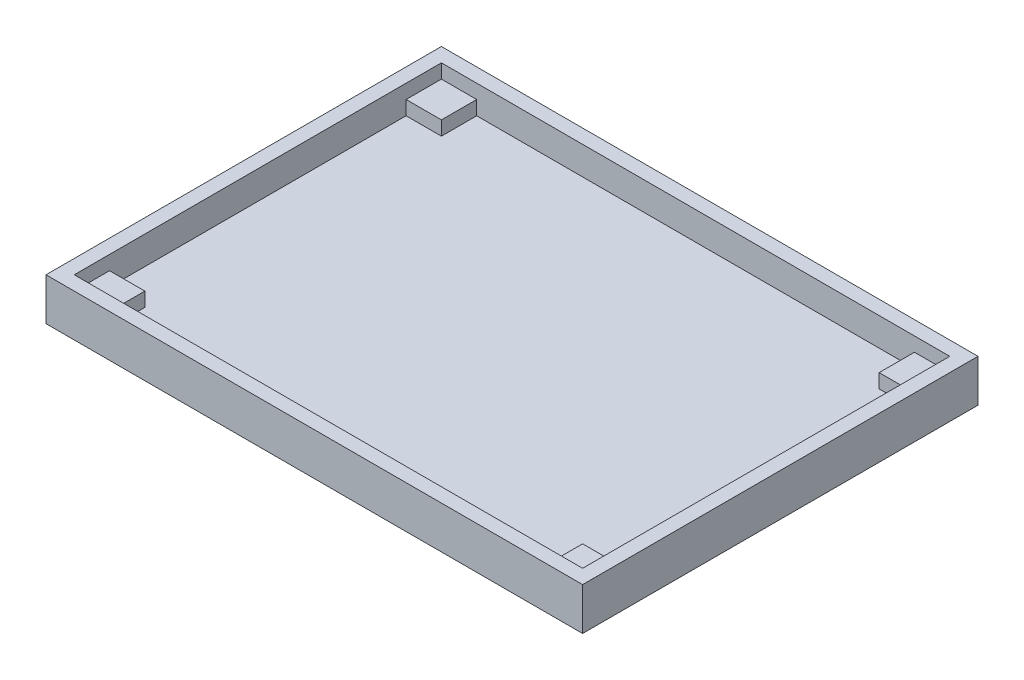
ISO-10303-21;
HEADER;
FILE_DESCRIPTION(('STEP AP214'),'2;1');
FILE_NAME('part.step','',(''),(''),'','','');
FILE_SCHEMA(('AUTOMOTIVE_DESIGN { 1 0 10303 214 1 1 1 1 }'));
ENDSEC;
DATA;
#1=APPLICATION_CONTEXT('core data for automotive mechanical design processes');
#2=APPLICATION_PROTOCOL_DEFINITION('international standard','automotive_design',2000,#1);
#3=PRODUCT_CONTEXT('',#1,'mechanical');
#4=PRODUCT('Part','Part','',(#3));
#5=PRODUCT_RELATED_PRODUCT_CATEGORY('part','',(#4));
#6=PRODUCT_DEFINITION_FORMATION('','',#4);
#7=PRODUCT_DEFINITION_CONTEXT('part definition',#1,'design');
#8=PRODUCT_DEFINITION('design','',#6,#7);
#9=PRODUCT_DEFINITION_SHAPE('','',#8);
#10=(LENGTH_UNIT() NAMED_UNIT(*) SI_UNIT(.MILLI.,.METRE.));
#11=(NAMED_UNIT(*) PLANE_ANGLE_UNIT() SI_UNIT($,.RADIAN.));
#12=(NAMED_UNIT(*) SI_UNIT($,.STERADIAN.) SOLID_ANGLE_UNIT());
#13=UNCERTAINTY_MEASURE_WITH_UNIT(LENGTH_MEASURE(1.E-05),#10,'distance_accuracy_value','');
#14=(GEOMETRIC_REPRESENTATION_CONTEXT(3) GLOBAL_UNCERTAINTY_ASSIGNED_CONTEXT((#13)) GLOBAL_UNIT_ASSIGNED_CONTEXT((#10,
#11,#12)) REPRESENTATION_CONTEXT('',''));
#15=CARTESIAN_POINT('',(0.,0.,0.));
#16=DIRECTION('',(0.,0.,1.));
#17=DIRECTION('',(1.,0.,0.));
#18=AXIS2_PLACEMENT_3D('',#15,#16,#17);
#19=CARTESIAN_POINT('',(0.,2.,-53.));
#20=DIRECTION('',(0.,0.,-1.));
#21=DIRECTION('',(-1.,0.,0.));
#22=AXIS2_PLACEMENT_3D('',#19,#20,#21);
#23=PLANE('',#22);
#24=DIRECTION('',(1.,0.,0.));
#25=VECTOR('',#24,1.);
#26=CARTESIAN_POINT('',(0.,0.,-53.));
#27=LINE('',#26,#25);
#28=CARTESIAN_POINT('',(-3.,0.,-53.));
#29=VERTEX_POINT('',#28);
#30=CARTESIAN_POINT('',(73.,0.,-53.));
#31=VERTEX_POINT('',#30);
#32=EDGE_CURVE('E187',#29,#31,#27,.T.);
#33=ORIENTED_EDGE('',*,*,#32,.F.);
#34=DIRECTION('',(0.,-1.,0.));
#35=VECTOR('',#34,1.);
#36=CARTESIAN_POINT('',(-3.,2.,-53.));
#37=LINE('',#36,#35);
#38=CARTESIAN_POINT('',(-3.,6.,-53.));
#39=VERTEX_POINT('',#38);
#40=EDGE_CURVE('E11',#39,#29,#37,.T.);
#41=ORIENTED_EDGE('',*,*,#40,.F.);
#42=DIRECTION('',(1.,0.,0.));
#43=VECTOR('',#42,1.);
#44=CARTESIAN_POINT('',(0.,6.,-53.));
#45=LINE('',#44,#43);
#46=CARTESIAN_POINT('',(73.,6.,-53.));
#47=VERTEX_POINT('',#46);
#48=EDGE_CURVE('E185',#39,#47,#45,.T.);
#49=ORIENTED_EDGE('',*,*,#48,.T.);
#50=DIRECTION('',(0.,-1.,0.));
#51=VECTOR('',#50,1.);
#52=CARTESIAN_POINT('',(73.,2.,-53.));
#53=LINE('',#52,#51);
#54=EDGE_CURVE('E70',#47,#31,#53,.T.);
#55=ORIENTED_EDGE('',*,*,#54,.T.);
#56=EDGE_LOOP('',(#33,#41,#49,#55));
#57=FACE_BOUND('',#56,.T.);
#58=ADVANCED_FACE('F47',(#57),#23,.T.);
#59=CARTESIAN_POINT('',(-3.,2.,0.));
#60=DIRECTION('',(1.,0.,0.));
#61=DIRECTION('',(0.,0.,-1.));
#62=AXIS2_PLACEMENT_3D('',#59,#60,#61);
#63=PLANE('',#62);
#64=DIRECTION('',(0.,0.,1.));
#65=VECTOR('',#64,1.);
#66=CARTESIAN_POINT('',(-3.,0.,0.));
#67=LINE('',#66,#65);
#68=CARTESIAN_POINT('',(-3.,0.,2.99999999999999));
#69=VERTEX_POINT('',#68);
#70=EDGE_CURVE('E385',#29,#69,#67,.T.);
#71=ORIENTED_EDGE('',*,*,#70,.T.);
#72=DIRECTION('',(0.,-1.,0.));
#73=VECTOR('',#72,1.);
#74=CARTESIAN_POINT('',(-3.,2.,2.99999999999999));
#75=LINE('',#74,#73);
#76=CARTESIAN_POINT('',(-3.,6.,2.99999999999999));
#77=VERTEX_POINT('',#76);
#78=EDGE_CURVE('E55',#77,#69,#75,.T.);
#79=ORIENTED_EDGE('',*,*,#78,.F.);
#80=DIRECTION('',(0.,0.,1.));
#81=VECTOR('',#80,1.);
#82=CARTESIAN_POINT('',(-3.,6.,0.));
#83=LINE('',#82,#81);
#84=EDGE_CURVE('E191',#39,#77,#83,.T.);
#85=ORIENTED_EDGE('',*,*,#84,.F.);
#86=ORIENTED_EDGE('',*,*,#40,.T.);
#87=EDGE_LOOP('',(#71,#79,#85,#86));
#88=FACE_BOUND('',#87,.T.);
#89=ADVANCED_FACE('F192',(#88),#63,.F.);
#90=CARTESIAN_POINT('',(0.,2.,2.99999999999999));
#91=DIRECTION('',(0.,0.,-1.));
#92=DIRECTION('',(-1.,0.,0.));
#93=AXIS2_PLACEMENT_3D('',#90,#91,#92);
#94=PLANE('',#93);
#95=DIRECTION('',(1.,0.,0.));
#96=VECTOR('',#95,1.);
#97=CARTESIAN_POINT('',(0.,0.,2.99999999999999));
#98=LINE('',#97,#96);
#99=CARTESIAN_POINT('',(73.,0.,2.99999999999999));
#100=VERTEX_POINT('',#99);
#101=EDGE_CURVE('E388',#69,#100,#98,.T.);
#102=ORIENTED_EDGE('',*,*,#101,.T.);
#103=DIRECTION('',(0.,-1.,0.));
#104=VECTOR('',#103,1.);
#105=CARTESIAN_POINT('',(73.,2.,2.99999999999999));
#106=LINE('',#105,#104);
#107=CARTESIAN_POINT('',(73.,6.,2.99999999999999));
#108=VERTEX_POINT('',#107);
#109=EDGE_CURVE('E398',#108,#100,#106,.T.);
#110=ORIENTED_EDGE('',*,*,#109,.F.);
#111=DIRECTION('',(1.,0.,0.));
#112=VECTOR('',#111,1.);
#113=CARTESIAN_POINT('',(0.,6.,2.99999999999999));
#114=LINE('',#113,#112);
#115=EDGE_CURVE('E198',#77,#108,#114,.T.);
#116=ORIENTED_EDGE('',*,*,#115,.F.);
#117=ORIENTED_EDGE('',*,*,#78,.T.);
#118=EDGE_LOOP('',(#102,#110,#116,#117));
#119=FACE_BOUND('',#118,.T.);
#120=ADVANCED_FACE('F403',(#119),#94,.F.);
#121=CARTESIAN_POINT('',(73.,2.,0.));
#122=DIRECTION('',(1.,0.,0.));
#123=DIRECTION('',(0.,0.,-1.));
#124=AXIS2_PLACEMENT_3D('',#121,#122,#123);
#125=PLANE('',#124);
#126=DIRECTION('',(0.,0.,1.));
#127=VECTOR('',#126,1.);
#128=CARTESIAN_POINT('',(73.,0.,0.));
#129=LINE('',#128,#127);
#130=EDGE_CURVE('E392',#31,#100,#129,.T.);
#131=ORIENTED_EDGE('',*,*,#130,.F.);
#132=ORIENTED_EDGE('',*,*,#54,.F.);
#133=DIRECTION('',(0.,0.,1.));
#134=VECTOR('',#133,1.);
#135=CARTESIAN_POINT('',(73.,6.,0.));
#136=LINE('',#135,#134);
#137=EDGE_CURVE('E203',#47,#108,#136,.T.);
#138=ORIENTED_EDGE('',*,*,#137,.T.);
#139=ORIENTED_EDGE('',*,*,#109,.T.);
#140=EDGE_LOOP('',(#131,#132,#138,#139));
#141=FACE_BOUND('',#140,.T.);
#142=ADVANCED_FACE('F408',(#141),#125,.T.);
#143=CARTESIAN_POINT('',(0.,0.,0.));
#144=DIRECTION('',(0.,1.,0.));
#145=DIRECTION('',(0.,0.,1.));
#146=AXIS2_PLACEMENT_3D('',#143,#144,#145);
#147=PLANE('',#146);
#148=ORIENTED_EDGE('',*,*,#32,.T.);
#149=ORIENTED_EDGE('',*,*,#130,.T.);
#150=ORIENTED_EDGE('',*,*,#101,.F.);
#151=ORIENTED_EDGE('',*,*,#70,.F.);
#152=EDGE_LOOP('',(#148,#149,#150,#151));
#153=FACE_BOUND('',#152,.T.);
#154=ADVANCED_FACE('F405',(#153),#147,.F.);
#155=CARTESIAN_POINT('',(71.,6.,0.));
#156=DIRECTION('',(-1.,0.,0.));
#157=DIRECTION('',(0.,0.,1.));
#158=AXIS2_PLACEMENT_3D('',#155,#156,#157);
#159=PLANE('',#158);
#160=DIRECTION('',(0.,-1.,0.));
#161=VECTOR('',#160,1.);
#162=CARTESIAN_POINT('',(71.,4.,-46.));
#163=LINE('',#162,#161);
#164=CARTESIAN_POINT('',(71.,4.,-46.));
#165=VERTEX_POINT('',#164);
#166=CARTESIAN_POINT('',(71.,2.,-46.));
#167=VERTEX_POINT('',#166);
#168=EDGE_CURVE('E296',#165,#167,#163,.T.);
#169=ORIENTED_EDGE('',*,*,#168,.T.);
#170=DIRECTION('',(0.,0.,1.));
#171=VECTOR('',#170,1.);
#172=CARTESIAN_POINT('',(71.,2.,0.));
#173=LINE('',#172,#171);
#174=CARTESIAN_POINT('',(71.,2.,-4.));
#175=VERTEX_POINT('',#174);
#176=EDGE_CURVE('E244',#167,#175,#173,.T.);
#177=ORIENTED_EDGE('',*,*,#176,.T.);
#178=DIRECTION('',(0.,-1.,0.));
#179=VECTOR('',#178,1.);
#180=CARTESIAN_POINT('',(71.,4.,-4.));
#181=LINE('',#180,#179);
#182=CARTESIAN_POINT('',(71.,4.,-4.));
#183=VERTEX_POINT('',#182);
#184=EDGE_CURVE('E324',#183,#175,#181,.T.);
#185=ORIENTED_EDGE('',*,*,#184,.F.);
#186=DIRECTION('',(0.,0.,-1.));
#187=VECTOR('',#186,1.);
#188=CARTESIAN_POINT('',(71.,4.,0.));
#189=LINE('',#188,#187);
#190=CARTESIAN_POINT('',(71.,4.,1.));
#191=VERTEX_POINT('',#190);
#192=EDGE_CURVE('E313',#191,#183,#189,.T.);
#193=ORIENTED_EDGE('',*,*,#192,.F.);
#194=DIRECTION('',(0.,-1.,0.));
#195=VECTOR('',#194,1.);
#196=CARTESIAN_POINT('',(71.,6.,1.));
#197=LINE('',#196,#195);
#198=CARTESIAN_POINT('',(71.,6.,1.));
#199=VERTEX_POINT('',#198);
#200=EDGE_CURVE('E230',#199,#191,#197,.T.);
#201=ORIENTED_EDGE('',*,*,#200,.F.);
#202=DIRECTION('',(0.,0.,-1.));
#203=VECTOR('',#202,1.);
#204=CARTESIAN_POINT('',(71.,6.,0.));
#205=LINE('',#204,#203);
#206=CARTESIAN_POINT('',(71.,6.,-51.));
#207=VERTEX_POINT('',#206);
#208=EDGE_CURVE('E218',#199,#207,#205,.T.);
#209=ORIENTED_EDGE('',*,*,#208,.T.);
#210=DIRECTION('',(0.,-1.,0.));
#211=VECTOR('',#210,1.);
#212=CARTESIAN_POINT('',(71.,6.,-51.));
#213=LINE('',#212,#211);
#214=CARTESIAN_POINT('',(71.,4.,-51.));
#215=VERTEX_POINT('',#214);
#216=EDGE_CURVE('E233',#207,#215,#213,.T.);
#217=ORIENTED_EDGE('',*,*,#216,.T.);
#218=DIRECTION('',(0.,0.,-1.));
#219=VECTOR('',#218,1.);
#220=CARTESIAN_POINT('',(71.,4.,0.));
#221=LINE('',#220,#219);
#222=EDGE_CURVE('E292',#165,#215,#221,.T.);
#223=ORIENTED_EDGE('',*,*,#222,.F.);
#224=EDGE_LOOP('',(#169,#177,#185,#193,#201,#209,#217,#223));
#225=FACE_BOUND('',#224,.T.);
#226=ADVANCED_FACE('F415',(#225),#159,.T.);
#227=CARTESIAN_POINT('',(-1.,6.,0.));
#228=DIRECTION('',(-1.,0.,0.));
#229=DIRECTION('',(0.,0.,1.));
#230=AXIS2_PLACEMENT_3D('',#227,#228,#229);
#231=PLANE('',#230);
#232=DIRECTION('',(0.,0.,-1.));
#233=VECTOR('',#232,1.);
#234=CARTESIAN_POINT('',(-1.,4.,0.));
#235=LINE('',#234,#233);
#236=CARTESIAN_POINT('',(-1.,4.,1.));
#237=VERTEX_POINT('',#236);
#238=CARTESIAN_POINT('',(-1.,4.,-4.));
#239=VERTEX_POINT('',#238);
#240=EDGE_CURVE('E340',#237,#239,#235,.T.);
#241=ORIENTED_EDGE('',*,*,#240,.T.);
#242=DIRECTION('',(0.,-1.,0.));
#243=VECTOR('',#242,1.);
#244=CARTESIAN_POINT('',(-1.,4.,-4.));
#245=LINE('',#244,#243);
#246=CARTESIAN_POINT('',(-1.,2.,-4.));
#247=VERTEX_POINT('',#246);
#248=EDGE_CURVE('E343',#239,#247,#245,.T.);
#249=ORIENTED_EDGE('',*,*,#248,.T.);
#250=DIRECTION('',(0.,0.,1.));
#251=VECTOR('',#250,1.);
#252=CARTESIAN_POINT('',(-1.,2.,0.));
#253=LINE('',#252,#251);
#254=CARTESIAN_POINT('',(-1.,2.,-46.));
#255=VERTEX_POINT('',#254);
#256=EDGE_CURVE('E251',#255,#247,#253,.T.);
#257=ORIENTED_EDGE('',*,*,#256,.F.);
#258=DIRECTION('',(0.,-1.,0.));
#259=VECTOR('',#258,1.);
#260=CARTESIAN_POINT('',(-1.,4.,-46.));
#261=LINE('',#260,#259);
#262=CARTESIAN_POINT('',(-1.,4.,-46.));
#263=VERTEX_POINT('',#262);
#264=EDGE_CURVE('E273',#263,#255,#261,.T.);
#265=ORIENTED_EDGE('',*,*,#264,.F.);
#266=DIRECTION('',(0.,0.,-1.));
#267=VECTOR('',#266,1.);
#268=CARTESIAN_POINT('',(-1.,4.,0.));
#269=LINE('',#268,#267);
#270=CARTESIAN_POINT('',(-1.,4.,-51.));
#271=VERTEX_POINT('',#270);
#272=EDGE_CURVE('E263',#263,#271,#269,.T.);
#273=ORIENTED_EDGE('',*,*,#272,.T.);
#274=DIRECTION('',(0.,-1.,0.));
#275=VECTOR('',#274,1.);
#276=CARTESIAN_POINT('',(-1.,6.,-51.));
#277=LINE('',#276,#275);
#278=CARTESIAN_POINT('',(-1.,6.,-51.));
#279=VERTEX_POINT('',#278);
#280=EDGE_CURVE('E237',#279,#271,#277,.T.);
#281=ORIENTED_EDGE('',*,*,#280,.F.);
#282=DIRECTION('',(0.,0.,-1.));
#283=VECTOR('',#282,1.);
#284=CARTESIAN_POINT('',(-1.,6.,0.));
#285=LINE('',#284,#283);
#286=CARTESIAN_POINT('',(-1.,6.,1.));
#287=VERTEX_POINT('',#286);
#288=EDGE_CURVE('E211',#287,#279,#285,.T.);
#289=ORIENTED_EDGE('',*,*,#288,.F.);
#290=DIRECTION('',(0.,-1.,0.));
#291=VECTOR('',#290,1.);
#292=CARTESIAN_POINT('',(-1.,6.,1.));
#293=LINE('',#292,#291);
#294=EDGE_CURVE('E226',#287,#237,#293,.T.);
#295=ORIENTED_EDGE('',*,*,#294,.T.);
#296=EDGE_LOOP('',(#241,#249,#257,#265,#273,#281,#289,#295));
#297=FACE_BOUND('',#296,.T.);
#298=ADVANCED_FACE('F449',(#297),#231,.F.);
#299=CARTESIAN_POINT('',(0.,6.,-51.));
#300=DIRECTION('',(0.,0.,-1.));
#301=DIRECTION('',(-1.,0.,0.));
#302=AXIS2_PLACEMENT_3D('',#299,#300,#301);
#303=PLANE('',#302);
#304=DIRECTION('',(1.,0.,0.));
#305=VECTOR('',#304,1.);
#306=CARTESIAN_POINT('',(0.,4.,-51.));
#307=LINE('',#306,#305);
#308=CARTESIAN_POINT('',(4.,4.,-51.));
#309=VERTEX_POINT('',#308);
#310=EDGE_CURVE('E259',#271,#309,#307,.T.);
#311=ORIENTED_EDGE('',*,*,#310,.T.);
#312=DIRECTION('',(0.,-1.,0.));
#313=VECTOR('',#312,1.);
#314=CARTESIAN_POINT('',(4.,4.,-51.));
#315=LINE('',#314,#313);
#316=CARTESIAN_POINT('',(4.,2.,-51.));
#317=VERTEX_POINT('',#316);
#318=EDGE_CURVE('E277',#309,#317,#315,.T.);
#319=ORIENTED_EDGE('',*,*,#318,.T.);
#320=DIRECTION('',(-1.,0.,0.));
#321=VECTOR('',#320,1.);
#322=CARTESIAN_POINT('',(0.,2.,-51.));
#323=LINE('',#322,#321);
#324=CARTESIAN_POINT('',(66.,2.,-51.));
#325=VERTEX_POINT('',#324);
#326=EDGE_CURVE('E247',#325,#317,#323,.T.);
#327=ORIENTED_EDGE('',*,*,#326,.F.);
#328=DIRECTION('',(0.,-1.,0.));
#329=VECTOR('',#328,1.);
#330=CARTESIAN_POINT('',(66.,4.,-51.));
#331=LINE('',#330,#329);
#332=CARTESIAN_POINT('',(66.,4.,-51.));
#333=VERTEX_POINT('',#332);
#334=EDGE_CURVE('E260',#333,#325,#331,.T.);
#335=ORIENTED_EDGE('',*,*,#334,.F.);
#336=DIRECTION('',(1.,0.,0.));
#337=VECTOR('',#336,1.);
#338=CARTESIAN_POINT('',(0.,4.,-51.));
#339=LINE('',#338,#337);
#340=EDGE_CURVE('E281',#333,#215,#339,.T.);
#341=ORIENTED_EDGE('',*,*,#340,.T.);
#342=ORIENTED_EDGE('',*,*,#216,.F.);
#343=DIRECTION('',(1.,0.,0.));
#344=VECTOR('',#343,1.);
#345=CARTESIAN_POINT('',(0.,6.,-51.));
#346=LINE('',#345,#344);
#347=EDGE_CURVE('E215',#279,#207,#346,.T.);
#348=ORIENTED_EDGE('',*,*,#347,.F.);
#349=ORIENTED_EDGE('',*,*,#280,.T.);
#350=EDGE_LOOP('',(#311,#319,#327,#335,#341,#342,#348,#349));
#351=FACE_BOUND('',#350,.T.);
#352=ADVANCED_FACE('F466',(#351),#303,.F.);
#353=CARTESIAN_POINT('',(0.,6.,1.));
#354=DIRECTION('',(0.,0.,-1.));
#355=DIRECTION('',(-1.,0.,0.));
#356=AXIS2_PLACEMENT_3D('',#353,#354,#355);
#357=PLANE('',#356);
#358=DIRECTION('',(0.,-1.,0.));
#359=VECTOR('',#358,1.);
#360=CARTESIAN_POINT('',(4.,4.,1.));
#361=LINE('',#360,#359);
#362=CARTESIAN_POINT('',(4.,4.,1.));
#363=VERTEX_POINT('',#362);
#364=CARTESIAN_POINT('',(4.,2.,1.));
#365=VERTEX_POINT('',#364);
#366=EDGE_CURVE('E350',#363,#365,#361,.T.);
#367=ORIENTED_EDGE('',*,*,#366,.F.);
#368=DIRECTION('',(1.,0.,0.));
#369=VECTOR('',#368,1.);
#370=CARTESIAN_POINT('',(0.,4.,1.));
#371=LINE('',#370,#369);
#372=EDGE_CURVE('E280',#237,#363,#371,.T.);
#373=ORIENTED_EDGE('',*,*,#372,.F.);
#374=ORIENTED_EDGE('',*,*,#294,.F.);
#375=DIRECTION('',(1.,0.,0.));
#376=VECTOR('',#375,1.);
#377=CARTESIAN_POINT('',(0.,6.,1.));
#378=LINE('',#377,#376);
#379=EDGE_CURVE('E222',#287,#199,#378,.T.);
#380=ORIENTED_EDGE('',*,*,#379,.T.);
#381=ORIENTED_EDGE('',*,*,#200,.T.);
#382=DIRECTION('',(1.,0.,0.));
#383=VECTOR('',#382,1.);
#384=CARTESIAN_POINT('',(0.,4.,1.));
#385=LINE('',#384,#383);
#386=CARTESIAN_POINT('',(66.,4.,1.));
#387=VERTEX_POINT('',#386);
#388=EDGE_CURVE('E309',#387,#191,#385,.T.);
#389=ORIENTED_EDGE('',*,*,#388,.F.);
#390=DIRECTION('',(0.,-1.,0.));
#391=VECTOR('',#390,1.);
#392=CARTESIAN_POINT('',(66.,4.,1.));
#393=LINE('',#392,#391);
#394=CARTESIAN_POINT('',(66.,2.,1.));
#395=VERTEX_POINT('',#394);
#396=EDGE_CURVE('E285',#387,#395,#393,.T.);
#397=ORIENTED_EDGE('',*,*,#396,.T.);
#398=DIRECTION('',(-1.,0.,0.));
#399=VECTOR('',#398,1.);
#400=CARTESIAN_POINT('',(0.,2.,1.));
#401=LINE('',#400,#399);
#402=EDGE_CURVE('E241',#395,#365,#401,.T.);
#403=ORIENTED_EDGE('',*,*,#402,.T.);
#404=EDGE_LOOP('',(#367,#373,#374,#380,#381,#389,#397,#403));
#405=FACE_BOUND('',#404,.T.);
#406=ADVANCED_FACE('F482',(#405),#357,.T.);
#407=CARTESIAN_POINT('',(0.,6.,0.));
#408=DIRECTION('',(0.,1.,0.));
#409=DIRECTION('',(0.,0.,1.));
#410=AXIS2_PLACEMENT_3D('',#407,#408,#409);
#411=PLANE('',#410);
#412=ORIENTED_EDGE('',*,*,#48,.F.);
#413=ORIENTED_EDGE('',*,*,#84,.T.);
#414=ORIENTED_EDGE('',*,*,#115,.T.);
#415=ORIENTED_EDGE('',*,*,#137,.F.);
#416=EDGE_LOOP('',(#412,#413,#414,#415));
#417=FACE_BOUND('',#416,.T.);
#418=ORIENTED_EDGE('',*,*,#288,.T.);
#419=ORIENTED_EDGE('',*,*,#347,.T.);
#420=ORIENTED_EDGE('',*,*,#208,.F.);
#421=ORIENTED_EDGE('',*,*,#379,.F.);
#422=EDGE_LOOP('',(#418,#419,#420,#421));
#423=FACE_BOUND('',#422,.T.);
#424=ADVANCED_FACE('F200',(#417,#423),#411,.T.);
#425=CARTESIAN_POINT('',(0.,4.,0.));
#426=DIRECTION('',(0.,1.,0.));
#427=DIRECTION('',(0.,0.,1.));
#428=AXIS2_PLACEMENT_3D('',#425,#426,#427);
#429=PLANE('',#428);
#430=ORIENTED_EDGE('',*,*,#340,.F.);
#431=DIRECTION('',(0.,0.,1.));
#432=VECTOR('',#431,1.);
#433=CARTESIAN_POINT('',(66.,4.,0.));
#434=LINE('',#433,#432);
#435=CARTESIAN_POINT('',(66.,4.,-46.));
#436=VERTEX_POINT('',#435);
#437=EDGE_CURVE('E284',#333,#436,#434,.T.);
#438=ORIENTED_EDGE('',*,*,#437,.T.);
#439=DIRECTION('',(-1.,0.,0.));
#440=VECTOR('',#439,1.);
#441=CARTESIAN_POINT('',(0.,4.,-46.));
#442=LINE('',#441,#440);
#443=EDGE_CURVE('E288',#165,#436,#442,.T.);
#444=ORIENTED_EDGE('',*,*,#443,.F.);
#445=ORIENTED_EDGE('',*,*,#222,.T.);
#446=EDGE_LOOP('',(#430,#438,#444,#445));
#447=FACE_BOUND('',#446,.T.);
#448=ADVANCED_FACE('F513',(#447),#429,.T.);
#449=CARTESIAN_POINT('',(0.,4.,-46.));
#450=DIRECTION('',(0.,0.,1.));
#451=DIRECTION('',(1.,0.,0.));
#452=AXIS2_PLACEMENT_3D('',#449,#450,#451);
#453=PLANE('',#452);
#454=DIRECTION('',(0.,-1.,0.));
#455=VECTOR('',#454,1.);
#456=CARTESIAN_POINT('',(66.,4.,-46.));
#457=LINE('',#456,#455);
#458=CARTESIAN_POINT('',(66.,2.,-46.));
#459=VERTEX_POINT('',#458);
#460=EDGE_CURVE('E299',#436,#459,#457,.T.);
#461=ORIENTED_EDGE('',*,*,#460,.T.);
#462=DIRECTION('',(1.,0.,0.));
#463=VECTOR('',#462,1.);
#464=CARTESIAN_POINT('',(0.,2.,-46.));
#465=LINE('',#464,#463);
#466=EDGE_CURVE('E367',#459,#167,#465,.T.);
#467=ORIENTED_EDGE('',*,*,#466,.T.);
#468=ORIENTED_EDGE('',*,*,#168,.F.);
#469=ORIENTED_EDGE('',*,*,#443,.T.);
#470=EDGE_LOOP('',(#461,#467,#468,#469));
#471=FACE_BOUND('',#470,.T.);
#472=ADVANCED_FACE('F523',(#471),#453,.T.);
#473=CARTESIAN_POINT('',(66.,4.,0.));
#474=DIRECTION('',(1.,0.,0.));
#475=DIRECTION('',(0.,0.,-1.));
#476=AXIS2_PLACEMENT_3D('',#473,#474,#475);
#477=PLANE('',#476);
#478=DIRECTION('',(0.,0.,-1.));
#479=VECTOR('',#478,1.);
#480=CARTESIAN_POINT('',(66.,2.,0.));
#481=LINE('',#480,#479);
#482=EDGE_CURVE('E371',#459,#325,#481,.T.);
#483=ORIENTED_EDGE('',*,*,#482,.F.);
#484=ORIENTED_EDGE('',*,*,#460,.F.);
#485=ORIENTED_EDGE('',*,*,#437,.F.);
#486=ORIENTED_EDGE('',*,*,#334,.T.);
#487=EDGE_LOOP('',(#483,#484,#485,#486));
#488=FACE_BOUND('',#487,.T.);
#489=ADVANCED_FACE('F533',(#488),#477,.F.);
#490=CARTESIAN_POINT('',(0.,4.,0.));
#491=DIRECTION('',(0.,1.,0.));
#492=DIRECTION('',(0.,0.,1.));
#493=AXIS2_PLACEMENT_3D('',#490,#491,#492);
#494=PLANE('',#493);
#495=DIRECTION('',(0.,0.,-1.));
#496=VECTOR('',#495,1.);
#497=CARTESIAN_POINT('',(66.,4.,0.));
#498=LINE('',#497,#496);
#499=CARTESIAN_POINT('',(66.,4.,-4.));
#500=VERTEX_POINT('',#499);
#501=EDGE_CURVE('E254',#387,#500,#498,.T.);
#502=ORIENTED_EDGE('',*,*,#501,.F.);
#503=ORIENTED_EDGE('',*,*,#388,.T.);
#504=ORIENTED_EDGE('',*,*,#192,.T.);
#505=DIRECTION('',(-1.,0.,0.));
#506=VECTOR('',#505,1.);
#507=CARTESIAN_POINT('',(0.,4.,-4.));
#508=LINE('',#507,#506);
#509=EDGE_CURVE('E317',#183,#500,#508,.T.);
#510=ORIENTED_EDGE('',*,*,#509,.T.);
#511=EDGE_LOOP('',(#502,#503,#504,#510));
#512=FACE_BOUND('',#511,.T.);
#513=ADVANCED_FACE('F542',(#512),#494,.T.);
#514=CARTESIAN_POINT('',(0.,4.,-4.));
#515=DIRECTION('',(0.,0.,1.));
#516=DIRECTION('',(1.,0.,0.));
#517=AXIS2_PLACEMENT_3D('',#514,#515,#516);
#518=PLANE('',#517);
#519=DIRECTION('',(1.,0.,0.));
#520=VECTOR('',#519,1.);
#521=CARTESIAN_POINT('',(0.,2.,-4.));
#522=LINE('',#521,#520);
#523=CARTESIAN_POINT('',(66.,2.,-4.));
#524=VERTEX_POINT('',#523);
#525=EDGE_CURVE('E375',#524,#175,#522,.T.);
#526=ORIENTED_EDGE('',*,*,#525,.F.);
#527=DIRECTION('',(0.,-1.,0.));
#528=VECTOR('',#527,1.);
#529=CARTESIAN_POINT('',(66.,4.,-4.));
#530=LINE('',#529,#528);
#531=EDGE_CURVE('E320',#500,#524,#530,.T.);
#532=ORIENTED_EDGE('',*,*,#531,.F.);
#533=ORIENTED_EDGE('',*,*,#509,.F.);
#534=ORIENTED_EDGE('',*,*,#184,.T.);
#535=EDGE_LOOP('',(#526,#532,#533,#534));
#536=FACE_BOUND('',#535,.T.);
#537=ADVANCED_FACE('F552',(#536),#518,.F.);
#538=CARTESIAN_POINT('',(66.,4.,0.));
#539=DIRECTION('',(-1.,0.,0.));
#540=DIRECTION('',(0.,0.,1.));
#541=AXIS2_PLACEMENT_3D('',#538,#539,#540);
#542=PLANE('',#541);
#543=ORIENTED_EDGE('',*,*,#531,.T.);
#544=DIRECTION('',(0.,0.,1.));
#545=VECTOR('',#544,1.);
#546=CARTESIAN_POINT('',(66.,2.,0.));
#547=LINE('',#546,#545);
#548=EDGE_CURVE('E379',#524,#395,#547,.T.);
#549=ORIENTED_EDGE('',*,*,#548,.T.);
#550=ORIENTED_EDGE('',*,*,#396,.F.);
#551=ORIENTED_EDGE('',*,*,#501,.T.);
#552=EDGE_LOOP('',(#543,#549,#550,#551));
#553=FACE_BOUND('',#552,.T.);
#554=ADVANCED_FACE('F562',(#553),#542,.T.);
#555=CARTESIAN_POINT('',(0.,4.,0.));
#556=DIRECTION('',(0.,1.,0.));
#557=DIRECTION('',(0.,0.,1.));
#558=AXIS2_PLACEMENT_3D('',#555,#556,#557);
#559=PLANE('',#558);
#560=ORIENTED_EDGE('',*,*,#372,.T.);
#561=DIRECTION('',(0.,0.,-1.));
#562=VECTOR('',#561,1.);
#563=CARTESIAN_POINT('',(4.,4.,0.));
#564=LINE('',#563,#562);
#565=CARTESIAN_POINT('',(4.,4.,-4.));
#566=VERTEX_POINT('',#565);
#567=EDGE_CURVE('E333',#363,#566,#564,.T.);
#568=ORIENTED_EDGE('',*,*,#567,.T.);
#569=DIRECTION('',(1.,0.,0.));
#570=VECTOR('',#569,1.);
#571=CARTESIAN_POINT('',(0.,4.,-4.));
#572=LINE('',#571,#570);
#573=EDGE_CURVE('E336',#239,#566,#572,.T.);
#574=ORIENTED_EDGE('',*,*,#573,.F.);
#575=ORIENTED_EDGE('',*,*,#240,.F.);
#576=EDGE_LOOP('',(#560,#568,#574,#575));
#577=FACE_BOUND('',#576,.T.);
#578=ADVANCED_FACE('F570',(#577),#559,.T.);
#579=CARTESIAN_POINT('',(0.,4.,-4.));
#580=DIRECTION('',(0.,0.,-1.));
#581=DIRECTION('',(-1.,0.,0.));
#582=AXIS2_PLACEMENT_3D('',#579,#580,#581);
#583=PLANE('',#582);
#584=DIRECTION('',(0.,-1.,0.));
#585=VECTOR('',#584,1.);
#586=CARTESIAN_POINT('',(4.,4.,-4.));
#587=LINE('',#586,#585);
#588=CARTESIAN_POINT('',(4.,2.,-4.));
#589=VERTEX_POINT('',#588);
#590=EDGE_CURVE('E346',#566,#589,#587,.T.);
#591=ORIENTED_EDGE('',*,*,#590,.T.);
#592=DIRECTION('',(-1.,0.,0.));
#593=VECTOR('',#592,1.);
#594=CARTESIAN_POINT('',(0.,2.,-4.));
#595=LINE('',#594,#593);
#596=EDGE_CURVE('E62',#589,#247,#595,.T.);
#597=ORIENTED_EDGE('',*,*,#596,.T.);
#598=ORIENTED_EDGE('',*,*,#248,.F.);
#599=ORIENTED_EDGE('',*,*,#573,.T.);
#600=EDGE_LOOP('',(#591,#597,#598,#599));
#601=FACE_BOUND('',#600,.T.);
#602=ADVANCED_FACE('F579',(#601),#583,.T.);
#603=CARTESIAN_POINT('',(4.,4.,0.));
#604=DIRECTION('',(-1.,0.,0.));
#605=DIRECTION('',(0.,0.,1.));
#606=AXIS2_PLACEMENT_3D('',#603,#604,#605);
#607=PLANE('',#606);
#608=DIRECTION('',(0.,0.,1.));
#609=VECTOR('',#608,1.);
#610=CARTESIAN_POINT('',(4.,2.,0.));
#611=LINE('',#610,#609);
#612=EDGE_CURVE('E356',#589,#365,#611,.T.);
#613=ORIENTED_EDGE('',*,*,#612,.F.);
#614=ORIENTED_EDGE('',*,*,#590,.F.);
#615=ORIENTED_EDGE('',*,*,#567,.F.);
#616=ORIENTED_EDGE('',*,*,#366,.T.);
#617=EDGE_LOOP('',(#613,#614,#615,#616));
#618=FACE_BOUND('',#617,.T.);
#619=ADVANCED_FACE('F589',(#618),#607,.F.);
#620=CARTESIAN_POINT('',(0.,4.,0.));
#621=DIRECTION('',(0.,1.,0.));
#622=DIRECTION('',(0.,0.,1.));
#623=AXIS2_PLACEMENT_3D('',#620,#621,#622);
#624=PLANE('',#623);
#625=DIRECTION('',(0.,0.,1.));
#626=VECTOR('',#625,1.);
#627=CARTESIAN_POINT('',(4.,4.,0.));
#628=LINE('',#627,#626);
#629=CARTESIAN_POINT('',(4.,4.,-46.));
#630=VERTEX_POINT('',#629);
#631=EDGE_CURVE('E255',#309,#630,#628,.T.);
#632=ORIENTED_EDGE('',*,*,#631,.F.);
#633=ORIENTED_EDGE('',*,*,#310,.F.);
#634=ORIENTED_EDGE('',*,*,#272,.F.);
#635=DIRECTION('',(1.,0.,0.));
#636=VECTOR('',#635,1.);
#637=CARTESIAN_POINT('',(0.,4.,-46.));
#638=LINE('',#637,#636);
#639=EDGE_CURVE('E266',#263,#630,#638,.T.);
#640=ORIENTED_EDGE('',*,*,#639,.T.);
#641=EDGE_LOOP('',(#632,#633,#634,#640));
#642=FACE_BOUND('',#641,.T.);
#643=ADVANCED_FACE('F598',(#642),#624,.T.);
#644=CARTESIAN_POINT('',(0.,4.,-46.));
#645=DIRECTION('',(0.,0.,-1.));
#646=DIRECTION('',(-1.,0.,0.));
#647=AXIS2_PLACEMENT_3D('',#644,#645,#646);
#648=PLANE('',#647);
#649=DIRECTION('',(-1.,0.,0.));
#650=VECTOR('',#649,1.);
#651=CARTESIAN_POINT('',(0.,2.,-46.));
#652=LINE('',#651,#650);
#653=CARTESIAN_POINT('',(4.,2.,-46.));
#654=VERTEX_POINT('',#653);
#655=EDGE_CURVE('E359',#654,#255,#652,.T.);
#656=ORIENTED_EDGE('',*,*,#655,.F.);
#657=DIRECTION('',(0.,-1.,0.));
#658=VECTOR('',#657,1.);
#659=CARTESIAN_POINT('',(4.,4.,-46.));
#660=LINE('',#659,#658);
#661=EDGE_CURVE('E269',#630,#654,#660,.T.);
#662=ORIENTED_EDGE('',*,*,#661,.F.);
#663=ORIENTED_EDGE('',*,*,#639,.F.);
#664=ORIENTED_EDGE('',*,*,#264,.T.);
#665=EDGE_LOOP('',(#656,#662,#663,#664));
#666=FACE_BOUND('',#665,.T.);
#667=ADVANCED_FACE('F607',(#666),#648,.F.);
#668=CARTESIAN_POINT('',(4.,4.,0.));
#669=DIRECTION('',(1.,0.,0.));
#670=DIRECTION('',(0.,0.,-1.));
#671=AXIS2_PLACEMENT_3D('',#668,#669,#670);
#672=PLANE('',#671);
#673=ORIENTED_EDGE('',*,*,#661,.T.);
#674=DIRECTION('',(0.,0.,-1.));
#675=VECTOR('',#674,1.);
#676=CARTESIAN_POINT('',(4.,2.,0.));
#677=LINE('',#676,#675);
#678=EDGE_CURVE('E363',#654,#317,#677,.T.);
#679=ORIENTED_EDGE('',*,*,#678,.T.);
#680=ORIENTED_EDGE('',*,*,#318,.F.);
#681=ORIENTED_EDGE('',*,*,#631,.T.);
#682=EDGE_LOOP('',(#673,#679,#680,#681));
#683=FACE_BOUND('',#682,.T.);
#684=ADVANCED_FACE('F616',(#683),#672,.T.);
#685=CARTESIAN_POINT('',(0.,2.,0.));
#686=DIRECTION('',(0.,1.,0.));
#687=DIRECTION('',(0.,0.,1.));
#688=AXIS2_PLACEMENT_3D('',#685,#686,#687);
#689=PLANE('',#688);
#690=ORIENTED_EDGE('',*,*,#655,.T.);
#691=ORIENTED_EDGE('',*,*,#256,.T.);
#692=ORIENTED_EDGE('',*,*,#596,.F.);
#693=ORIENTED_EDGE('',*,*,#612,.T.);
#694=ORIENTED_EDGE('',*,*,#402,.F.);
#695=ORIENTED_EDGE('',*,*,#548,.F.);
#696=ORIENTED_EDGE('',*,*,#525,.T.);
#697=ORIENTED_EDGE('',*,*,#176,.F.);
#698=ORIENTED_EDGE('',*,*,#466,.F.);
#699=ORIENTED_EDGE('',*,*,#482,.T.);
#700=ORIENTED_EDGE('',*,*,#326,.T.);
#701=ORIENTED_EDGE('',*,*,#678,.F.);
#702=EDGE_LOOP('',(#690,#691,#692,#693,#694,#695,#696,#697,#698,#699,#700,#701));
#703=FACE_BOUND('',#702,.T.);
#704=ADVANCED_FACE('F624',(#703),#689,.T.);
#705=CLOSED_SHELL('',(#58,#89,#120,#142,#154,#226,#298,#352,#406,#424,#448,#472,#489,#513,#537,
#554,#578,#602,#619,#643,#667,#684,#704));
#706=MANIFOLD_SOLID_BREP('B2',#705);
#707=ADVANCED_BREP_SHAPE_REPRESENTATION('',(#18,#706),#14);
#708=SHAPE_DEFINITION_REPRESENTATION(#9,#707);
ENDSEC;
END-ISO-10303-21;
